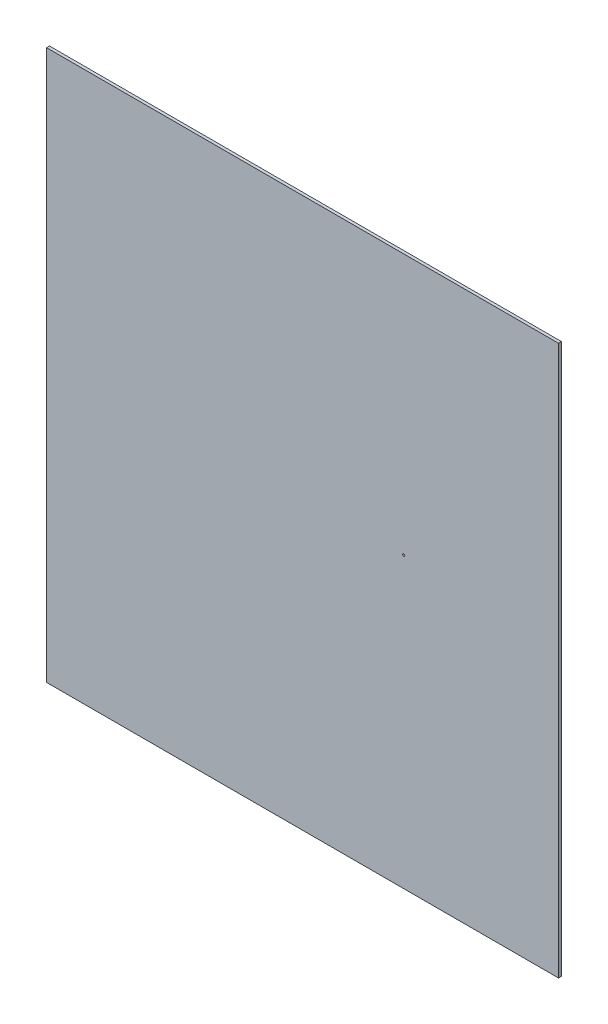
ISO-10303-21;
HEADER;
FILE_DESCRIPTION(('STEP AP214'),'2;1');
FILE_NAME('part.step','',(''),(''),'','','');
FILE_SCHEMA(('AUTOMOTIVE_DESIGN { 1 0 10303 214 1 1 1 1 }'));
ENDSEC;
DATA;
#1=APPLICATION_CONTEXT('core data for automotive mechanical design processes');
#2=APPLICATION_PROTOCOL_DEFINITION('international standard','automotive_design',2000,#1);
#3=PRODUCT_CONTEXT('',#1,'mechanical');
#4=PRODUCT('Part','Part','',(#3));
#5=PRODUCT_RELATED_PRODUCT_CATEGORY('part','',(#4));
#6=PRODUCT_DEFINITION_FORMATION('','',#4);
#7=PRODUCT_DEFINITION_CONTEXT('part definition',#1,'design');
#8=PRODUCT_DEFINITION('design','',#6,#7);
#9=PRODUCT_DEFINITION_SHAPE('','',#8);
#10=(LENGTH_UNIT() NAMED_UNIT(*) SI_UNIT(.MILLI.,.METRE.));
#11=(NAMED_UNIT(*) PLANE_ANGLE_UNIT() SI_UNIT($,.RADIAN.));
#12=(NAMED_UNIT(*) SI_UNIT($,.STERADIAN.) SOLID_ANGLE_UNIT());
#13=UNCERTAINTY_MEASURE_WITH_UNIT(LENGTH_MEASURE(1.E-05),#10,'distance_accuracy_value','');
#14=(GEOMETRIC_REPRESENTATION_CONTEXT(3) GLOBAL_UNCERTAINTY_ASSIGNED_CONTEXT((#13)) GLOBAL_UNIT_ASSIGNED_CONTEXT((#10,
#11,#12)) REPRESENTATION_CONTEXT('',''));
#15=CARTESIAN_POINT('',(0.,0.,0.));
#16=DIRECTION('',(0.,0.,1.));
#17=DIRECTION('',(1.,0.,0.));
#18=AXIS2_PLACEMENT_3D('',#15,#16,#17);
#19=CARTESIAN_POINT('',(25.4,96.7615548688899,0.39116));
#20=DIRECTION('',(1.,0.,0.));
#21=DIRECTION('',(0.,0.,-1.));
#22=AXIS2_PLACEMENT_3D('',#19,#20,#21);
#23=PLANE('',#22);
#24=DIRECTION('',(0.,-1.,0.));
#25=VECTOR('',#24,1.);
#26=CARTESIAN_POINT('',(25.4,96.7615548688899,0.));
#27=LINE('',#26,#25);
#28=CARTESIAN_POINT('',(25.4,96.7615548688899,0.));
#29=VERTEX_POINT('',#28);
#30=CARTESIAN_POINT('',(25.4,22.6621478664398,0.));
#31=VERTEX_POINT('',#30);
#32=EDGE_CURVE('E98',#29,#31,#27,.T.);
#33=ORIENTED_EDGE('',*,*,#32,.T.);
#34=DIRECTION('',(0.,0.,-1.));
#35=VECTOR('',#34,1.);
#36=CARTESIAN_POINT('',(25.4,22.6621478664398,0.39116));
#37=LINE('',#36,#35);
#38=CARTESIAN_POINT('',(25.4,22.6621478664398,0.39116));
#39=VERTEX_POINT('',#38);
#40=EDGE_CURVE('E11',#39,#31,#37,.T.);
#41=ORIENTED_EDGE('',*,*,#40,.F.);
#42=DIRECTION('',(0.,-1.,0.));
#43=VECTOR('',#42,1.);
#44=CARTESIAN_POINT('',(25.4,96.7615548688899,0.39116));
#45=LINE('',#44,#43);
#46=CARTESIAN_POINT('',(25.4,96.7615548688899,0.39116));
#47=VERTEX_POINT('',#46);
#48=EDGE_CURVE('E86',#47,#39,#45,.T.);
#49=ORIENTED_EDGE('',*,*,#48,.F.);
#50=DIRECTION('',(0.,0.,-1.));
#51=VECTOR('',#50,1.);
#52=CARTESIAN_POINT('',(25.4,96.7615548688899,0.39116));
#53=LINE('',#52,#51);
#54=EDGE_CURVE('E94',#47,#29,#53,.T.);
#55=ORIENTED_EDGE('',*,*,#54,.T.);
#56=EDGE_LOOP('',(#33,#41,#49,#55));
#57=FACE_BOUND('',#56,.T.);
#58=ADVANCED_FACE('F35',(#57),#23,.F.);
#59=CARTESIAN_POINT('',(25.4,22.6621478664398,0.39116));
#60=DIRECTION('',(0.,1.,0.));
#61=DIRECTION('',(-1.,0.,0.));
#62=AXIS2_PLACEMENT_3D('',#59,#60,#61);
#63=PLANE('',#62);
#64=DIRECTION('',(1.,0.,0.));
#65=VECTOR('',#64,1.);
#66=CARTESIAN_POINT('',(25.4,22.6621478664398,0.));
#67=LINE('',#66,#65);
#68=CARTESIAN_POINT('',(94.3970480690842,22.6621478664398,0.));
#69=VERTEX_POINT('',#68);
#70=EDGE_CURVE('E90',#31,#69,#67,.T.);
#71=ORIENTED_EDGE('',*,*,#70,.T.);
#72=DIRECTION('',(0.,0.,-1.));
#73=VECTOR('',#72,1.);
#74=CARTESIAN_POINT('',(94.3970480690842,22.6621478664398,0.39116));
#75=LINE('',#74,#73);
#76=CARTESIAN_POINT('',(94.3970480690842,22.6621478664398,0.39116));
#77=VERTEX_POINT('',#76);
#78=EDGE_CURVE('E43',#77,#69,#75,.T.);
#79=ORIENTED_EDGE('',*,*,#78,.F.);
#80=DIRECTION('',(1.,0.,0.));
#81=VECTOR('',#80,1.);
#82=CARTESIAN_POINT('',(25.4,22.6621478664398,0.39116));
#83=LINE('',#82,#81);
#84=EDGE_CURVE('E81',#39,#77,#83,.T.);
#85=ORIENTED_EDGE('',*,*,#84,.F.);
#86=ORIENTED_EDGE('',*,*,#40,.T.);
#87=EDGE_LOOP('',(#71,#79,#85,#86));
#88=FACE_BOUND('',#87,.T.);
#89=ADVANCED_FACE('F89',(#88),#63,.F.);
#90=CARTESIAN_POINT('',(94.3970480690842,22.6621478664398,0.39116));
#91=DIRECTION('',(-1.,0.,0.));
#92=DIRECTION('',(0.,-1.,0.));
#93=AXIS2_PLACEMENT_3D('',#90,#91,#92);
#94=PLANE('',#93);
#95=DIRECTION('',(0.,1.,0.));
#96=VECTOR('',#95,1.);
#97=CARTESIAN_POINT('',(94.3970480690842,22.6621478664398,0.));
#98=LINE('',#97,#96);
#99=CARTESIAN_POINT('',(94.3970480690842,96.7615548688899,0.));
#100=VERTEX_POINT('',#99);
#101=EDGE_CURVE('E68',#69,#100,#98,.T.);
#102=ORIENTED_EDGE('',*,*,#101,.T.);
#103=DIRECTION('',(0.,0.,-1.));
#104=VECTOR('',#103,1.);
#105=CARTESIAN_POINT('',(94.3970480690842,96.7615548688899,0.39116));
#106=LINE('',#105,#104);
#107=CARTESIAN_POINT('',(94.3970480690842,96.7615548688899,0.39116));
#108=VERTEX_POINT('',#107);
#109=EDGE_CURVE('E91',#108,#100,#106,.T.);
#110=ORIENTED_EDGE('',*,*,#109,.F.);
#111=DIRECTION('',(0.,1.,0.));
#112=VECTOR('',#111,1.);
#113=CARTESIAN_POINT('',(94.3970480690842,22.6621478664398,0.39116));
#114=LINE('',#113,#112);
#115=EDGE_CURVE('E84',#77,#108,#114,.T.);
#116=ORIENTED_EDGE('',*,*,#115,.F.);
#117=ORIENTED_EDGE('',*,*,#78,.T.);
#118=EDGE_LOOP('',(#102,#110,#116,#117));
#119=FACE_BOUND('',#118,.T.);
#120=ADVANCED_FACE('F92',(#119),#94,.F.);
#121=CARTESIAN_POINT('',(94.3970480690842,96.7615548688899,0.39116));
#122=DIRECTION('',(0.,-1.,0.));
#123=DIRECTION('',(1.,0.,0.));
#124=AXIS2_PLACEMENT_3D('',#121,#122,#123);
#125=PLANE('',#124);
#126=DIRECTION('',(-1.,0.,0.));
#127=VECTOR('',#126,1.);
#128=CARTESIAN_POINT('',(94.3970480690842,96.7615548688899,0.));
#129=LINE('',#128,#127);
#130=EDGE_CURVE('E74',#100,#29,#129,.T.);
#131=ORIENTED_EDGE('',*,*,#130,.T.);
#132=ORIENTED_EDGE('',*,*,#54,.F.);
#133=DIRECTION('',(-1.,0.,0.));
#134=VECTOR('',#133,1.);
#135=CARTESIAN_POINT('',(94.3970480690842,96.7615548688899,0.39116));
#136=LINE('',#135,#134);
#137=EDGE_CURVE('E51',#108,#47,#136,.T.);
#138=ORIENTED_EDGE('',*,*,#137,.F.);
#139=ORIENTED_EDGE('',*,*,#109,.T.);
#140=EDGE_LOOP('',(#131,#132,#138,#139));
#141=FACE_BOUND('',#140,.T.);
#142=ADVANCED_FACE('F106',(#141),#125,.F.);
#143=CARTESIAN_POINT('',(0.,0.,0.39116));
#144=DIRECTION('',(0.,0.,1.));
#145=DIRECTION('',(1.,0.,0.));
#146=AXIS2_PLACEMENT_3D('',#143,#144,#145);
#147=PLANE('',#146);
#148=CARTESIAN_POINT('',(73.533,61.595,0.39116));
#149=DIRECTION('',(0.,0.,1.));
#150=DIRECTION('',(1.,0.,0.));
#151=AXIS2_PLACEMENT_3D('',#148,#149,#150);
#152=CIRCLE('',#151,0.149999999999997);
#153=CARTESIAN_POINT('',(73.683,61.595,0.39116));
#154=VERTEX_POINT('',#153);
#155=EDGE_CURVE('E112',#154,#154,#152,.T.);
#156=ORIENTED_EDGE('',*,*,#155,.F.);
#157=EDGE_LOOP('',(#156));
#158=FACE_BOUND('',#157,.T.);
#159=ORIENTED_EDGE('',*,*,#48,.T.);
#160=ORIENTED_EDGE('',*,*,#84,.T.);
#161=ORIENTED_EDGE('',*,*,#115,.T.);
#162=ORIENTED_EDGE('',*,*,#137,.T.);
#163=EDGE_LOOP('',(#159,#160,#161,#162));
#164=FACE_BOUND('',#163,.T.);
#165=ADVANCED_FACE('F82',(#158,#164),#147,.T.);
#166=CARTESIAN_POINT('',(0.,0.,0.));
#167=DIRECTION('',(0.,0.,1.));
#168=DIRECTION('',(1.,0.,0.));
#169=AXIS2_PLACEMENT_3D('',#166,#167,#168);
#170=PLANE('',#169);
#171=CARTESIAN_POINT('',(73.533,61.595,0.));
#172=DIRECTION('',(0.,0.,1.));
#173=DIRECTION('',(1.,0.,0.));
#174=AXIS2_PLACEMENT_3D('',#171,#172,#173);
#175=CIRCLE('',#174,0.149999999999997);
#176=CARTESIAN_POINT('',(73.683,61.595,0.));
#177=VERTEX_POINT('',#176);
#178=EDGE_CURVE('E101',#177,#177,#175,.T.);
#179=ORIENTED_EDGE('',*,*,#178,.T.);
#180=EDGE_LOOP('',(#179));
#181=FACE_BOUND('',#180,.T.);
#182=ORIENTED_EDGE('',*,*,#32,.F.);
#183=ORIENTED_EDGE('',*,*,#130,.F.);
#184=ORIENTED_EDGE('',*,*,#101,.F.);
#185=ORIENTED_EDGE('',*,*,#70,.F.);
#186=EDGE_LOOP('',(#182,#183,#184,#185));
#187=FACE_BOUND('',#186,.T.);
#188=ADVANCED_FACE('F109',(#181,#187),#170,.F.);
#189=CARTESIAN_POINT('',(73.533,61.595,0.));
#190=DIRECTION('',(0.,0.,1.));
#191=DIRECTION('',(1.,0.,0.));
#192=AXIS2_PLACEMENT_3D('',#189,#190,#191);
#193=CYLINDRICAL_SURFACE('',#192,0.149999999999997);
#194=ORIENTED_EDGE('',*,*,#178,.F.);
#195=EDGE_LOOP('',(#194));
#196=FACE_BOUND('',#195,.T.);
#197=ORIENTED_EDGE('',*,*,#155,.T.);
#198=EDGE_LOOP('',(#197));
#199=FACE_BOUND('',#198,.T.);
#200=ADVANCED_FACE('F119',(#196,#199),#193,.F.);
#201=CLOSED_SHELL('',(#58,#89,#120,#142,#165,#188,#200));
#202=MANIFOLD_SOLID_BREP('B2',#201);
#203=ADVANCED_BREP_SHAPE_REPRESENTATION('',(#18,#202),#14);
#204=SHAPE_DEFINITION_REPRESENTATION(#9,#203);
ENDSEC;
END-ISO-10303-21;
